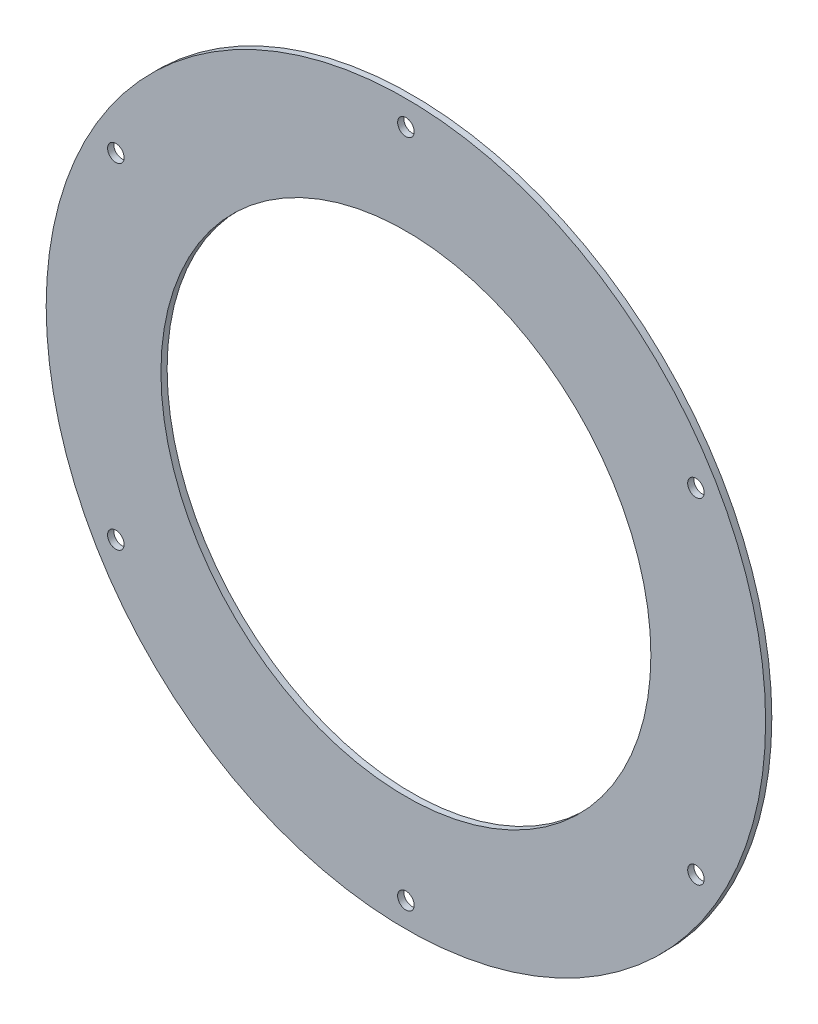
ISO-10303-21;
HEADER;
FILE_DESCRIPTION(('STEP AP214'),'2;1');
FILE_NAME('part.step','',(''),(''),'','','');
FILE_SCHEMA(('AUTOMOTIVE_DESIGN { 1 0 10303 214 1 1 1 1 }'));
ENDSEC;
DATA;
#1=APPLICATION_CONTEXT('core data for automotive mechanical design processes');
#2=APPLICATION_PROTOCOL_DEFINITION('international standard','automotive_design',2000,#1);
#3=PRODUCT_CONTEXT('',#1,'mechanical');
#4=PRODUCT('Part','Part','',(#3));
#5=PRODUCT_RELATED_PRODUCT_CATEGORY('part','',(#4));
#6=PRODUCT_DEFINITION_FORMATION('','',#4);
#7=PRODUCT_DEFINITION_CONTEXT('part definition',#1,'design');
#8=PRODUCT_DEFINITION('design','',#6,#7);
#9=PRODUCT_DEFINITION_SHAPE('','',#8);
#10=(LENGTH_UNIT() NAMED_UNIT(*) SI_UNIT(.MILLI.,.METRE.));
#11=(NAMED_UNIT(*) PLANE_ANGLE_UNIT() SI_UNIT($,.RADIAN.));
#12=(NAMED_UNIT(*) SI_UNIT($,.STERADIAN.) SOLID_ANGLE_UNIT());
#13=UNCERTAINTY_MEASURE_WITH_UNIT(LENGTH_MEASURE(1.E-05),#10,'distance_accuracy_value','');
#14=(GEOMETRIC_REPRESENTATION_CONTEXT(3) GLOBAL_UNCERTAINTY_ASSIGNED_CONTEXT((#13)) GLOBAL_UNIT_ASSIGNED_CONTEXT((#10,
#11,#12)) REPRESENTATION_CONTEXT('',''));
#15=CARTESIAN_POINT('',(0.,0.,0.));
#16=DIRECTION('',(0.,0.,1.));
#17=DIRECTION('',(1.,0.,0.));
#18=AXIS2_PLACEMENT_3D('',#15,#16,#17);
#19=CARTESIAN_POINT('',(0.,0.,3.));
#20=DIRECTION('',(0.,0.,1.));
#21=DIRECTION('',(1.,0.,0.));
#22=AXIS2_PLACEMENT_3D('',#19,#20,#21);
#23=PLANE('',#22);
#24=CARTESIAN_POINT('',(-140.296115413069,-81.000000000006,3.));
#25=DIRECTION('',(0.,0.,1.));
#26=DIRECTION('',(1.,0.,0.));
#27=AXIS2_PLACEMENT_3D('',#24,#25,#26);
#28=CIRCLE('',#27,4.0000000000131);
#29=CARTESIAN_POINT('',(-136.296115413056,-81.000000000006,3.));
#30=VERTEX_POINT('',#29);
#31=EDGE_CURVE('E77',#30,#30,#28,.T.);
#32=ORIENTED_EDGE('',*,*,#31,.F.);
#33=EDGE_LOOP('',(#32));
#34=FACE_BOUND('',#33,.T.);
#35=CARTESIAN_POINT('',(140.296115413089,-80.999999999994,3.));
#36=DIRECTION('',(0.,0.,1.));
#37=DIRECTION('',(1.,0.,0.));
#38=AXIS2_PLACEMENT_3D('',#35,#36,#37);
#39=CIRCLE('',#38,4.00000000000888);
#40=CARTESIAN_POINT('',(144.296115413098,-80.999999999994,3.));
#41=VERTEX_POINT('',#40);
#42=EDGE_CURVE('E65',#41,#41,#39,.T.);
#43=ORIENTED_EDGE('',*,*,#42,.F.);
#44=EDGE_LOOP('',(#43));
#45=FACE_BOUND('',#44,.T.);
#46=CARTESIAN_POINT('',(0.,0.,3.));
#47=DIRECTION('',(0.,0.,1.));
#48=DIRECTION('',(1.,0.,0.));
#49=AXIS2_PLACEMENT_3D('',#46,#47,#48);
#50=CIRCLE('',#49,118.5);
#51=CARTESIAN_POINT('',(118.5,0.,3.));
#52=VERTEX_POINT('',#51);
#53=EDGE_CURVE('E53',#52,#52,#50,.T.);
#54=ORIENTED_EDGE('',*,*,#53,.F.);
#55=EDGE_LOOP('',(#54));
#56=FACE_BOUND('',#55,.T.);
#57=CARTESIAN_POINT('',(0.,0.,3.));
#58=DIRECTION('',(0.,0.,1.));
#59=DIRECTION('',(1.,0.,0.));
#60=AXIS2_PLACEMENT_3D('',#57,#58,#59);
#61=CIRCLE('',#60,174.);
#62=CARTESIAN_POINT('',(174.,0.,3.));
#63=VERTEX_POINT('',#62);
#64=EDGE_CURVE('E10',#63,#63,#61,.T.);
#65=ORIENTED_EDGE('',*,*,#64,.T.);
#66=EDGE_LOOP('',(#65));
#67=FACE_BOUND('',#66,.T.);
#68=CARTESIAN_POINT('',(0.,162.,3.));
#69=DIRECTION('',(0.,0.,1.));
#70=DIRECTION('',(1.,0.,0.));
#71=AXIS2_PLACEMENT_3D('',#68,#69,#70);
#72=CIRCLE('',#71,4.);
#73=CARTESIAN_POINT('',(4.,162.,3.));
#74=VERTEX_POINT('',#73);
#75=EDGE_CURVE('E48',#74,#74,#72,.T.);
#76=ORIENTED_EDGE('',*,*,#75,.F.);
#77=EDGE_LOOP('',(#76));
#78=FACE_BOUND('',#77,.T.);
#79=CARTESIAN_POINT('',(140.296115413082,81.000000000006,3.));
#80=DIRECTION('',(0.,0.,1.));
#81=DIRECTION('',(1.,0.,0.));
#82=AXIS2_PLACEMENT_3D('',#79,#80,#81);
#83=CIRCLE('',#82,4.00000000000197);
#84=CARTESIAN_POINT('',(144.296115413084,81.000000000006,3.));
#85=VERTEX_POINT('',#84);
#86=EDGE_CURVE('E59',#85,#85,#83,.T.);
#87=ORIENTED_EDGE('',*,*,#86,.F.);
#88=EDGE_LOOP('',(#87));
#89=FACE_BOUND('',#88,.T.);
#90=CARTESIAN_POINT('',(1.37549025248968E-11,-162.,3.));
#91=DIRECTION('',(0.,0.,1.));
#92=DIRECTION('',(1.,0.,0.));
#93=AXIS2_PLACEMENT_3D('',#90,#91,#92);
#94=CIRCLE('',#93,4.00000000001424);
#95=CARTESIAN_POINT('',(4.00000000002799,-162.,3.));
#96=VERTEX_POINT('',#95);
#97=EDGE_CURVE('E71',#96,#96,#94,.T.);
#98=ORIENTED_EDGE('',*,*,#97,.F.);
#99=EDGE_LOOP('',(#98));
#100=FACE_BOUND('',#99,.T.);
#101=CARTESIAN_POINT('',(-140.296115413076,80.9999999999939,3.));
#102=DIRECTION('',(0.,0.,1.));
#103=DIRECTION('',(1.,0.,0.));
#104=AXIS2_PLACEMENT_3D('',#101,#102,#103);
#105=CIRCLE('',#104,4.00000000000697);
#106=CARTESIAN_POINT('',(-136.296115413069,80.9999999999939,3.));
#107=VERTEX_POINT('',#106);
#108=EDGE_CURVE('E83',#107,#107,#105,.T.);
#109=ORIENTED_EDGE('',*,*,#108,.F.);
#110=EDGE_LOOP('',(#109));
#111=FACE_BOUND('',#110,.T.);
#112=ADVANCED_FACE('F37',(#34,#45,#56,#67,#78,#89,#100,#111),#23,.T.);
#113=CARTESIAN_POINT('',(0.,0.,0.));
#114=DIRECTION('',(0.,0.,1.));
#115=DIRECTION('',(1.,0.,0.));
#116=AXIS2_PLACEMENT_3D('',#113,#114,#115);
#117=PLANE('',#116);
#118=CARTESIAN_POINT('',(0.,0.,0.));
#119=DIRECTION('',(0.,0.,1.));
#120=DIRECTION('',(1.,0.,0.));
#121=AXIS2_PLACEMENT_3D('',#118,#119,#120);
#122=CIRCLE('',#121,174.);
#123=CARTESIAN_POINT('',(174.,0.,0.));
#124=VERTEX_POINT('',#123);
#125=EDGE_CURVE('E41',#124,#124,#122,.T.);
#126=ORIENTED_EDGE('',*,*,#125,.F.);
#127=EDGE_LOOP('',(#126));
#128=FACE_BOUND('',#127,.T.);
#129=CARTESIAN_POINT('',(0.,162.,0.));
#130=DIRECTION('',(0.,0.,1.));
#131=DIRECTION('',(1.,0.,0.));
#132=AXIS2_PLACEMENT_3D('',#129,#130,#131);
#133=CIRCLE('',#132,4.);
#134=CARTESIAN_POINT('',(4.,162.,0.));
#135=VERTEX_POINT('',#134);
#136=EDGE_CURVE('E50',#135,#135,#133,.T.);
#137=ORIENTED_EDGE('',*,*,#136,.T.);
#138=EDGE_LOOP('',(#137));
#139=FACE_BOUND('',#138,.T.);
#140=CARTESIAN_POINT('',(0.,0.,0.));
#141=DIRECTION('',(0.,0.,1.));
#142=DIRECTION('',(1.,0.,0.));
#143=AXIS2_PLACEMENT_3D('',#140,#141,#142);
#144=CIRCLE('',#143,118.5);
#145=CARTESIAN_POINT('',(118.5,0.,0.));
#146=VERTEX_POINT('',#145);
#147=EDGE_CURVE('E56',#146,#146,#144,.T.);
#148=ORIENTED_EDGE('',*,*,#147,.T.);
#149=EDGE_LOOP('',(#148));
#150=FACE_BOUND('',#149,.T.);
#151=CARTESIAN_POINT('',(140.296115413082,81.000000000006,0.));
#152=DIRECTION('',(0.,0.,1.));
#153=DIRECTION('',(1.,0.,0.));
#154=AXIS2_PLACEMENT_3D('',#151,#152,#153);
#155=CIRCLE('',#154,4.00000000000197);
#156=CARTESIAN_POINT('',(144.296115413084,81.000000000006,0.));
#157=VERTEX_POINT('',#156);
#158=EDGE_CURVE('E62',#157,#157,#155,.T.);
#159=ORIENTED_EDGE('',*,*,#158,.T.);
#160=EDGE_LOOP('',(#159));
#161=FACE_BOUND('',#160,.T.);
#162=CARTESIAN_POINT('',(140.296115413089,-80.999999999994,0.));
#163=DIRECTION('',(0.,0.,1.));
#164=DIRECTION('',(1.,0.,0.));
#165=AXIS2_PLACEMENT_3D('',#162,#163,#164);
#166=CIRCLE('',#165,4.00000000000888);
#167=CARTESIAN_POINT('',(144.296115413098,-80.999999999994,0.));
#168=VERTEX_POINT('',#167);
#169=EDGE_CURVE('E68',#168,#168,#166,.T.);
#170=ORIENTED_EDGE('',*,*,#169,.T.);
#171=EDGE_LOOP('',(#170));
#172=FACE_BOUND('',#171,.T.);
#173=CARTESIAN_POINT('',(1.37549025248968E-11,-162.,0.));
#174=DIRECTION('',(0.,0.,1.));
#175=DIRECTION('',(1.,0.,0.));
#176=AXIS2_PLACEMENT_3D('',#173,#174,#175);
#177=CIRCLE('',#176,4.00000000001424);
#178=CARTESIAN_POINT('',(4.00000000002799,-162.,0.));
#179=VERTEX_POINT('',#178);
#180=EDGE_CURVE('E74',#179,#179,#177,.T.);
#181=ORIENTED_EDGE('',*,*,#180,.T.);
#182=EDGE_LOOP('',(#181));
#183=FACE_BOUND('',#182,.T.);
#184=CARTESIAN_POINT('',(-140.296115413069,-81.000000000006,0.));
#185=DIRECTION('',(0.,0.,1.));
#186=DIRECTION('',(1.,0.,0.));
#187=AXIS2_PLACEMENT_3D('',#184,#185,#186);
#188=CIRCLE('',#187,4.0000000000131);
#189=CARTESIAN_POINT('',(-136.296115413056,-81.000000000006,0.));
#190=VERTEX_POINT('',#189);
#191=EDGE_CURVE('E80',#190,#190,#188,.T.);
#192=ORIENTED_EDGE('',*,*,#191,.T.);
#193=EDGE_LOOP('',(#192));
#194=FACE_BOUND('',#193,.T.);
#195=CARTESIAN_POINT('',(-140.296115413076,80.9999999999939,0.));
#196=DIRECTION('',(0.,0.,1.));
#197=DIRECTION('',(1.,0.,0.));
#198=AXIS2_PLACEMENT_3D('',#195,#196,#197);
#199=CIRCLE('',#198,4.00000000000697);
#200=CARTESIAN_POINT('',(-136.296115413069,80.9999999999939,0.));
#201=VERTEX_POINT('',#200);
#202=EDGE_CURVE('E86',#201,#201,#199,.T.);
#203=ORIENTED_EDGE('',*,*,#202,.T.);
#204=EDGE_LOOP('',(#203));
#205=FACE_BOUND('',#204,.T.);
#206=ADVANCED_FACE('F96',(#128,#139,#150,#161,#172,#183,#194,#205),#117,.F.);
#207=CARTESIAN_POINT('',(0.,0.,3.));
#208=DIRECTION('',(0.,0.,-1.));
#209=DIRECTION('',(-1.,0.,0.));
#210=AXIS2_PLACEMENT_3D('',#207,#208,#209);
#211=CYLINDRICAL_SURFACE('',#210,174.);
#212=ORIENTED_EDGE('',*,*,#64,.F.);
#213=EDGE_LOOP('',(#212));
#214=FACE_BOUND('',#213,.T.);
#215=ORIENTED_EDGE('',*,*,#125,.T.);
#216=EDGE_LOOP('',(#215));
#217=FACE_BOUND('',#216,.T.);
#218=ADVANCED_FACE('F39',(#214,#217),#211,.T.);
#219=CARTESIAN_POINT('',(0.,162.,3.));
#220=DIRECTION('',(0.,0.,-1.));
#221=DIRECTION('',(-1.,0.,0.));
#222=AXIS2_PLACEMENT_3D('',#219,#220,#221);
#223=CYLINDRICAL_SURFACE('',#222,4.);
#224=ORIENTED_EDGE('',*,*,#75,.T.);
#225=EDGE_LOOP('',(#224));
#226=FACE_BOUND('',#225,.T.);
#227=ORIENTED_EDGE('',*,*,#136,.F.);
#228=EDGE_LOOP('',(#227));
#229=FACE_BOUND('',#228,.T.);
#230=ADVANCED_FACE('F106',(#226,#229),#223,.F.);
#231=CARTESIAN_POINT('',(0.,0.,3.));
#232=DIRECTION('',(0.,0.,-1.));
#233=DIRECTION('',(-1.,0.,0.));
#234=AXIS2_PLACEMENT_3D('',#231,#232,#233);
#235=CYLINDRICAL_SURFACE('',#234,118.5);
#236=ORIENTED_EDGE('',*,*,#53,.T.);
#237=EDGE_LOOP('',(#236));
#238=FACE_BOUND('',#237,.T.);
#239=ORIENTED_EDGE('',*,*,#147,.F.);
#240=EDGE_LOOP('',(#239));
#241=FACE_BOUND('',#240,.T.);
#242=ADVANCED_FACE('F109',(#238,#241),#235,.F.);
#243=CARTESIAN_POINT('',(140.296115413082,81.000000000006,3.));
#244=DIRECTION('',(0.,0.,-1.));
#245=DIRECTION('',(-1.,0.,0.));
#246=AXIS2_PLACEMENT_3D('',#243,#244,#245);
#247=CYLINDRICAL_SURFACE('',#246,4.00000000000197);
#248=ORIENTED_EDGE('',*,*,#86,.T.);
#249=EDGE_LOOP('',(#248));
#250=FACE_BOUND('',#249,.T.);
#251=ORIENTED_EDGE('',*,*,#158,.F.);
#252=EDGE_LOOP('',(#251));
#253=FACE_BOUND('',#252,.T.);
#254=ADVANCED_FACE('F113',(#250,#253),#247,.F.);
#255=CARTESIAN_POINT('',(140.296115413089,-80.999999999994,3.));
#256=DIRECTION('',(0.,0.,-1.));
#257=DIRECTION('',(-1.,0.,0.));
#258=AXIS2_PLACEMENT_3D('',#255,#256,#257);
#259=CYLINDRICAL_SURFACE('',#258,4.00000000000888);
#260=ORIENTED_EDGE('',*,*,#42,.T.);
#261=EDGE_LOOP('',(#260));
#262=FACE_BOUND('',#261,.T.);
#263=ORIENTED_EDGE('',*,*,#169,.F.);
#264=EDGE_LOOP('',(#263));
#265=FACE_BOUND('',#264,.T.);
#266=ADVANCED_FACE('F117',(#262,#265),#259,.F.);
#267=CARTESIAN_POINT('',(1.37549025248968E-11,-162.,3.));
#268=DIRECTION('',(0.,0.,-1.));
#269=DIRECTION('',(-1.,0.,0.));
#270=AXIS2_PLACEMENT_3D('',#267,#268,#269);
#271=CYLINDRICAL_SURFACE('',#270,4.00000000001424);
#272=ORIENTED_EDGE('',*,*,#97,.T.);
#273=EDGE_LOOP('',(#272));
#274=FACE_BOUND('',#273,.T.);
#275=ORIENTED_EDGE('',*,*,#180,.F.);
#276=EDGE_LOOP('',(#275));
#277=FACE_BOUND('',#276,.T.);
#278=ADVANCED_FACE('F121',(#274,#277),#271,.F.);
#279=CARTESIAN_POINT('',(-140.296115413069,-81.000000000006,3.));
#280=DIRECTION('',(0.,0.,-1.));
#281=DIRECTION('',(-1.,0.,0.));
#282=AXIS2_PLACEMENT_3D('',#279,#280,#281);
#283=CYLINDRICAL_SURFACE('',#282,4.0000000000131);
#284=ORIENTED_EDGE('',*,*,#31,.T.);
#285=EDGE_LOOP('',(#284));
#286=FACE_BOUND('',#285,.T.);
#287=ORIENTED_EDGE('',*,*,#191,.F.);
#288=EDGE_LOOP('',(#287));
#289=FACE_BOUND('',#288,.T.);
#290=ADVANCED_FACE('F125',(#286,#289),#283,.F.);
#291=CARTESIAN_POINT('',(-140.296115413076,80.9999999999939,3.));
#292=DIRECTION('',(0.,0.,-1.));
#293=DIRECTION('',(-1.,0.,0.));
#294=AXIS2_PLACEMENT_3D('',#291,#292,#293);
#295=CYLINDRICAL_SURFACE('',#294,4.00000000000697);
#296=ORIENTED_EDGE('',*,*,#108,.T.);
#297=EDGE_LOOP('',(#296));
#298=FACE_BOUND('',#297,.T.);
#299=ORIENTED_EDGE('',*,*,#202,.F.);
#300=EDGE_LOOP('',(#299));
#301=FACE_BOUND('',#300,.T.);
#302=ADVANCED_FACE('F92',(#298,#301),#295,.F.);
#303=CLOSED_SHELL('',(#112,#206,#218,#230,#242,#254,#266,#278,#290,#302));
#304=MANIFOLD_SOLID_BREP('B2',#303);
#305=ADVANCED_BREP_SHAPE_REPRESENTATION('',(#18,#304),#14);
#306=SHAPE_DEFINITION_REPRESENTATION(#9,#305);
ENDSEC;
END-ISO-10303-21;
